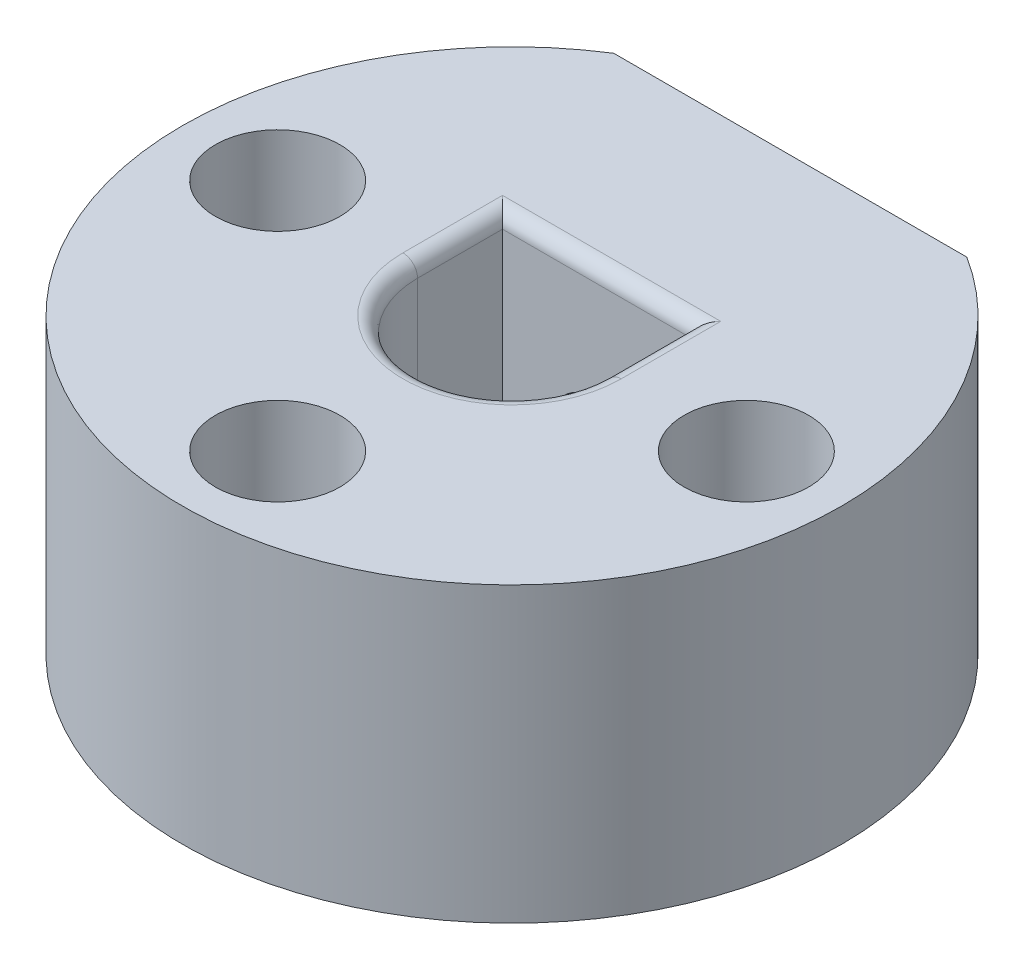
ISO-10303-21;
HEADER;
FILE_DESCRIPTION(('STEP AP214'),'2;1');
FILE_NAME('part.step','',(''),(''),'','','');
FILE_SCHEMA(('AUTOMOTIVE_DESIGN { 1 0 10303 214 1 1 1 1 }'));
ENDSEC;
DATA;
#1=APPLICATION_CONTEXT('core data for automotive mechanical design processes');
#2=APPLICATION_PROTOCOL_DEFINITION('international standard','automotive_design',2000,#1);
#3=PRODUCT_CONTEXT('',#1,'mechanical');
#4=PRODUCT('Part','Part','',(#3));
#5=PRODUCT_RELATED_PRODUCT_CATEGORY('part','',(#4));
#6=PRODUCT_DEFINITION_FORMATION('','',#4);
#7=PRODUCT_DEFINITION_CONTEXT('part definition',#1,'design');
#8=PRODUCT_DEFINITION('design','',#6,#7);
#9=PRODUCT_DEFINITION_SHAPE('','',#8);
#10=(LENGTH_UNIT() NAMED_UNIT(*) SI_UNIT(.MILLI.,.METRE.));
#11=(NAMED_UNIT(*) PLANE_ANGLE_UNIT() SI_UNIT($,.RADIAN.));
#12=(NAMED_UNIT(*) SI_UNIT($,.STERADIAN.) SOLID_ANGLE_UNIT());
#13=UNCERTAINTY_MEASURE_WITH_UNIT(LENGTH_MEASURE(1.E-05),#10,'distance_accuracy_value','');
#14=(GEOMETRIC_REPRESENTATION_CONTEXT(3) GLOBAL_UNCERTAINTY_ASSIGNED_CONTEXT((#13)) GLOBAL_UNIT_ASSIGNED_CONTEXT((#10,
#11,#12)) REPRESENTATION_CONTEXT('',''));
#15=CARTESIAN_POINT('',(0.,0.,0.));
#16=DIRECTION('',(0.,0.,1.));
#17=DIRECTION('',(1.,0.,0.));
#18=AXIS2_PLACEMENT_3D('',#15,#16,#17);
#19=CARTESIAN_POINT('',(0.,4.5,-9.5));
#20=DIRECTION('',(0.,0.,1.));
#21=DIRECTION('',(1.,0.,0.));
#22=AXIS2_PLACEMENT_3D('',#19,#20,#21);
#23=CYLINDRICAL_SURFACE('',#22,1.6);
#24=DIRECTION('',(0.,0.,1.));
#25=VECTOR('',#24,1.);
#26=CARTESIAN_POINT('',(0.556776436283002,3.,-9.5));
#27=LINE('',#26,#25);
#28=CARTESIAN_POINT('',(0.556776436283002,3.,-2.9));
#29=VERTEX_POINT('',#28);
#30=CARTESIAN_POINT('',(0.556776436283002,3.,-4.4));
#31=VERTEX_POINT('',#30);
#32=EDGE_CURVE('E291',#29,#31,#27,.F.);
#33=ORIENTED_EDGE('',*,*,#32,.F.);
#34=CARTESIAN_POINT('',(0.,4.5,-2.9));
#35=DIRECTION('',(0.,0.,1.));
#36=DIRECTION('',(1.,0.,0.));
#37=AXIS2_PLACEMENT_3D('',#34,#35,#36);
#38=CIRCLE('',#37,1.6);
#39=CARTESIAN_POINT('',(-0.556776436283002,3.,-2.9));
#40=VERTEX_POINT('',#39);
#41=EDGE_CURVE('E184',#29,#40,#38,.T.);
#42=ORIENTED_EDGE('',*,*,#41,.T.);
#43=DIRECTION('',(0.,0.,1.));
#44=VECTOR('',#43,1.);
#45=CARTESIAN_POINT('',(-0.556776436283002,3.,-9.5));
#46=LINE('',#45,#44);
#47=CARTESIAN_POINT('',(-0.556776436283002,3.,-4.4));
#48=VERTEX_POINT('',#47);
#49=EDGE_CURVE('E293',#48,#40,#46,.T.);
#50=ORIENTED_EDGE('',*,*,#49,.F.);
#51=CARTESIAN_POINT('',(0.,4.5,-4.4));
#52=DIRECTION('',(0.,0.,-1.));
#53=DIRECTION('',(-1.,0.,0.));
#54=AXIS2_PLACEMENT_3D('',#51,#52,#53);
#55=CIRCLE('',#54,1.6);
#56=EDGE_CURVE('E180',#31,#48,#55,.F.);
#57=ORIENTED_EDGE('',*,*,#56,.F.);
#58=EDGE_LOOP('',(#33,#42,#50,#57));
#59=FACE_BOUND('',#58,.T.);
#60=ADVANCED_FACE('F36',(#59),#23,.F.);
#61=CARTESIAN_POINT('',(0.,10.,0.));
#62=DIRECTION('',(0.,-1.,0.));
#63=DIRECTION('',(0.,0.,-1.));
#64=AXIS2_PLACEMENT_3D('',#61,#62,#63);
#65=CYLINDRICAL_SURFACE('',#64,3.225);
#66=DIRECTION('',(0.,-1.,0.));
#67=VECTOR('',#66,1.);
#68=CARTESIAN_POINT('',(3.225,10.,0.));
#69=LINE('',#68,#67);
#70=CARTESIAN_POINT('',(3.225,9.5,0.));
#71=VERTEX_POINT('',#70);
#72=CARTESIAN_POINT('',(3.225,3.,0.));
#73=VERTEX_POINT('',#72);
#74=EDGE_CURVE('E232',#71,#73,#69,.T.);
#75=ORIENTED_EDGE('',*,*,#74,.T.);
#76=CARTESIAN_POINT('',(0.,3.,0.));
#77=DIRECTION('',(0.,-1.,0.));
#78=DIRECTION('',(0.,0.,-1.));
#79=AXIS2_PLACEMENT_3D('',#76,#77,#78);
#80=CIRCLE('',#79,3.225);
#81=CARTESIAN_POINT('',(-3.225,3.,0.));
#82=VERTEX_POINT('',#81);
#83=EDGE_CURVE('E304',#73,#82,#80,.T.);
#84=ORIENTED_EDGE('',*,*,#83,.T.);
#85=DIRECTION('',(0.,-1.,0.));
#86=VECTOR('',#85,1.);
#87=CARTESIAN_POINT('',(-3.225,10.,0.));
#88=LINE('',#87,#86);
#89=CARTESIAN_POINT('',(-3.225,9.5,0.));
#90=VERTEX_POINT('',#89);
#91=EDGE_CURVE('E223',#90,#82,#88,.T.);
#92=ORIENTED_EDGE('',*,*,#91,.F.);
#93=CARTESIAN_POINT('',(0.,9.5,0.));
#94=DIRECTION('',(0.,1.,0.));
#95=DIRECTION('',(0.,0.,1.));
#96=AXIS2_PLACEMENT_3D('',#93,#94,#95);
#97=CIRCLE('',#96,3.225);
#98=EDGE_CURVE('E267',#90,#71,#97,.T.);
#99=ORIENTED_EDGE('',*,*,#98,.T.);
#100=EDGE_LOOP('',(#75,#84,#92,#99));
#101=FACE_BOUND('',#100,.T.);
#102=ADVANCED_FACE('F344',(#101),#65,.F.);
#103=CARTESIAN_POINT('',(3.225,10.,0.));
#104=DIRECTION('',(-1.,0.,0.));
#105=DIRECTION('',(0.,0.,1.));
#106=AXIS2_PLACEMENT_3D('',#103,#104,#105);
#107=PLANE('',#106);
#108=DIRECTION('',(0.,-1.,0.));
#109=VECTOR('',#108,1.);
#110=CARTESIAN_POINT('',(3.225,10.,-2.9));
#111=LINE('',#110,#109);
#112=CARTESIAN_POINT('',(3.225,9.5,-2.9));
#113=VERTEX_POINT('',#112);
#114=CARTESIAN_POINT('',(3.225,3.,-2.9));
#115=VERTEX_POINT('',#114);
#116=EDGE_CURVE('E229',#113,#115,#111,.T.);
#117=ORIENTED_EDGE('',*,*,#116,.T.);
#118=DIRECTION('',(0.,0.,1.));
#119=VECTOR('',#118,1.);
#120=CARTESIAN_POINT('',(3.225,3.,0.));
#121=LINE('',#120,#119);
#122=EDGE_CURVE('E307',#115,#73,#121,.T.);
#123=ORIENTED_EDGE('',*,*,#122,.T.);
#124=ORIENTED_EDGE('',*,*,#74,.F.);
#125=DIRECTION('',(0.,0.,-1.));
#126=VECTOR('',#125,1.);
#127=CARTESIAN_POINT('',(3.225,9.5,0.));
#128=LINE('',#127,#126);
#129=EDGE_CURVE('E263',#71,#113,#128,.T.);
#130=ORIENTED_EDGE('',*,*,#129,.T.);
#131=EDGE_LOOP('',(#117,#123,#124,#130));
#132=FACE_BOUND('',#131,.T.);
#133=ADVANCED_FACE('F350',(#132),#107,.T.);
#134=CARTESIAN_POINT('',(3.225,10.,-2.9));
#135=DIRECTION('',(0.,0.,1.));
#136=DIRECTION('',(1.,0.,0.));
#137=AXIS2_PLACEMENT_3D('',#134,#135,#136);
#138=PLANE('',#137);
#139=DIRECTION('',(0.,-1.,0.));
#140=VECTOR('',#139,1.);
#141=CARTESIAN_POINT('',(-3.225,10.,-2.9));
#142=LINE('',#141,#140);
#143=CARTESIAN_POINT('',(-3.225,9.5,-2.9));
#144=VERTEX_POINT('',#143);
#145=CARTESIAN_POINT('',(-3.225,3.,-2.9));
#146=VERTEX_POINT('',#145);
#147=EDGE_CURVE('E226',#144,#146,#142,.T.);
#148=ORIENTED_EDGE('',*,*,#147,.T.);
#149=DIRECTION('',(1.,0.,0.));
#150=VECTOR('',#149,1.);
#151=CARTESIAN_POINT('',(3.225,3.,-2.9));
#152=LINE('',#151,#150);
#153=EDGE_CURVE('E295',#146,#40,#152,.T.);
#154=ORIENTED_EDGE('',*,*,#153,.T.);
#155=ORIENTED_EDGE('',*,*,#41,.F.);
#156=EDGE_CURVE('E299',#29,#115,#152,.T.);
#157=ORIENTED_EDGE('',*,*,#156,.T.);
#158=ORIENTED_EDGE('',*,*,#116,.F.);
#159=DIRECTION('',(-1.,0.,0.));
#160=VECTOR('',#159,1.);
#161=CARTESIAN_POINT('',(3.225,9.5,-2.9));
#162=LINE('',#161,#160);
#163=EDGE_CURVE('E265',#113,#144,#162,.T.);
#164=ORIENTED_EDGE('',*,*,#163,.T.);
#165=EDGE_LOOP('',(#148,#154,#155,#157,#158,#164));
#166=FACE_BOUND('',#165,.T.);
#167=ADVANCED_FACE('F426',(#166),#138,.T.);
#168=CARTESIAN_POINT('',(-3.225,10.,0.));
#169=DIRECTION('',(1.,0.,0.));
#170=DIRECTION('',(0.,0.,-1.));
#171=AXIS2_PLACEMENT_3D('',#168,#169,#170);
#172=PLANE('',#171);
#173=ORIENTED_EDGE('',*,*,#91,.T.);
#174=DIRECTION('',(0.,0.,-1.));
#175=VECTOR('',#174,1.);
#176=CARTESIAN_POINT('',(-3.225,3.,0.));
#177=LINE('',#176,#175);
#178=EDGE_CURVE('E297',#82,#146,#177,.T.);
#179=ORIENTED_EDGE('',*,*,#178,.T.);
#180=ORIENTED_EDGE('',*,*,#147,.F.);
#181=DIRECTION('',(0.,0.,1.));
#182=VECTOR('',#181,1.);
#183=CARTESIAN_POINT('',(-3.225,9.5,0.));
#184=LINE('',#183,#182);
#185=EDGE_CURVE('E251',#144,#90,#184,.T.);
#186=ORIENTED_EDGE('',*,*,#185,.T.);
#187=EDGE_LOOP('',(#173,#179,#180,#186));
#188=FACE_BOUND('',#187,.T.);
#189=ADVANCED_FACE('F365',(#188),#172,.T.);
#190=CARTESIAN_POINT('',(0.,0.,0.));
#191=DIRECTION('',(0.,1.,0.));
#192=DIRECTION('',(0.,0.,1.));
#193=AXIS2_PLACEMENT_3D('',#190,#191,#192);
#194=PLANE('',#193);
#195=CARTESIAN_POINT('',(0.,0.,0.));
#196=DIRECTION('',(0.,1.,0.));
#197=DIRECTION('',(0.,0.,1.));
#198=AXIS2_PLACEMENT_3D('',#195,#196,#197);
#199=CIRCLE('',#198,11.25);
#200=CARTESIAN_POINT('',(-6.02598539659698,0.,-9.5));
#201=VERTEX_POINT('',#200);
#202=CARTESIAN_POINT('',(6.02598539659698,0.,-9.5));
#203=VERTEX_POINT('',#202);
#204=EDGE_CURVE('E235',#201,#203,#199,.T.);
#205=ORIENTED_EDGE('',*,*,#204,.F.);
#206=DIRECTION('',(-1.,0.,0.));
#207=VECTOR('',#206,1.);
#208=CARTESIAN_POINT('',(6.02598539659698,0.,-9.5));
#209=LINE('',#208,#207);
#210=EDGE_CURVE('E240',#203,#201,#209,.T.);
#211=ORIENTED_EDGE('',*,*,#210,.F.);
#212=EDGE_LOOP('',(#205,#211));
#213=FACE_BOUND('',#212,.T.);
#214=CARTESIAN_POINT('',(0.,0.,8.));
#215=DIRECTION('',(0.,1.,0.));
#216=DIRECTION('',(0.,0.,1.));
#217=AXIS2_PLACEMENT_3D('',#214,#215,#216);
#218=CIRCLE('',#217,1.25);
#219=CARTESIAN_POINT('',(0.,0.,9.25));
#220=VERTEX_POINT('',#219);
#221=EDGE_CURVE('E220',#220,#220,#218,.T.);
#222=ORIENTED_EDGE('',*,*,#221,.T.);
#223=EDGE_LOOP('',(#222));
#224=FACE_BOUND('',#223,.T.);
#225=CARTESIAN_POINT('',(-8.,0.,-1.68080962984129E-13));
#226=DIRECTION('',(0.,1.,0.));
#227=DIRECTION('',(0.,0.,1.));
#228=AXIS2_PLACEMENT_3D('',#225,#226,#227);
#229=CIRCLE('',#228,1.25);
#230=CARTESIAN_POINT('',(-8.,0.,1.24999999999983));
#231=VERTEX_POINT('',#230);
#232=EDGE_CURVE('E208',#231,#231,#229,.T.);
#233=ORIENTED_EDGE('',*,*,#232,.T.);
#234=EDGE_LOOP('',(#233));
#235=FACE_BOUND('',#234,.T.);
#236=CARTESIAN_POINT('',(8.,0.,0.));
#237=DIRECTION('',(0.,1.,0.));
#238=DIRECTION('',(0.,0.,1.));
#239=AXIS2_PLACEMENT_3D('',#236,#237,#238);
#240=CIRCLE('',#239,1.25);
#241=CARTESIAN_POINT('',(8.,0.,1.25));
#242=VERTEX_POINT('',#241);
#243=EDGE_CURVE('E196',#242,#242,#240,.T.);
#244=ORIENTED_EDGE('',*,*,#243,.T.);
#245=EDGE_LOOP('',(#244));
#246=FACE_BOUND('',#245,.T.);
#247=DIRECTION('',(1.,0.,0.));
#248=VECTOR('',#247,1.);
#249=CARTESIAN_POINT('',(-2.925,0.,-4.4));
#250=LINE('',#249,#248);
#251=CARTESIAN_POINT('',(-2.925,0.,-4.4));
#252=VERTEX_POINT('',#251);
#253=CARTESIAN_POINT('',(-0.943398113205662,0.,-4.4));
#254=VERTEX_POINT('',#253);
#255=EDGE_CURVE('E158',#252,#254,#250,.T.);
#256=ORIENTED_EDGE('',*,*,#255,.T.);
#257=CARTESIAN_POINT('',(0.,0.,0.));
#258=DIRECTION('',(0.,-1.,0.));
#259=DIRECTION('',(0.,0.,-1.));
#260=AXIS2_PLACEMENT_3D('',#257,#258,#259);
#261=CIRCLE('',#260,4.5);
#262=CARTESIAN_POINT('',(0.943398113205662,0.,-4.4));
#263=VERTEX_POINT('',#262);
#264=EDGE_CURVE('E150',#263,#254,#261,.T.);
#265=ORIENTED_EDGE('',*,*,#264,.F.);
#266=CARTESIAN_POINT('',(2.925,0.,-4.4));
#267=VERTEX_POINT('',#266);
#268=EDGE_CURVE('E59',#263,#267,#250,.T.);
#269=ORIENTED_EDGE('',*,*,#268,.T.);
#270=DIRECTION('',(0.,0.,-1.));
#271=VECTOR('',#270,1.);
#272=CARTESIAN_POINT('',(2.925,0.,-4.4));
#273=LINE('',#272,#271);
#274=CARTESIAN_POINT('',(2.925,0.,-6.65));
#275=VERTEX_POINT('',#274);
#276=EDGE_CURVE('E311',#267,#275,#273,.T.);
#277=ORIENTED_EDGE('',*,*,#276,.T.);
#278=DIRECTION('',(-1.,0.,0.));
#279=VECTOR('',#278,1.);
#280=CARTESIAN_POINT('',(-2.925,0.,-6.65));
#281=LINE('',#280,#279);
#282=CARTESIAN_POINT('',(-2.925,0.,-6.65));
#283=VERTEX_POINT('',#282);
#284=EDGE_CURVE('E167',#275,#283,#281,.T.);
#285=ORIENTED_EDGE('',*,*,#284,.T.);
#286=DIRECTION('',(0.,0.,1.));
#287=VECTOR('',#286,1.);
#288=CARTESIAN_POINT('',(-2.925,0.,-4.4));
#289=LINE('',#288,#287);
#290=EDGE_CURVE('E164',#283,#252,#289,.T.);
#291=ORIENTED_EDGE('',*,*,#290,.T.);
#292=EDGE_LOOP('',(#256,#265,#269,#277,#285,#291));
#293=FACE_BOUND('',#292,.T.);
#294=ADVANCED_FACE('F155',(#213,#224,#235,#246,#293),#194,.F.);
#295=CARTESIAN_POINT('',(0.,4.5,-9.5));
#296=DIRECTION('',(0.,0.,1.));
#297=DIRECTION('',(1.,0.,0.));
#298=AXIS2_PLACEMENT_3D('',#295,#296,#297);
#299=CIRCLE('',#298,1.6);
#300=CARTESIAN_POINT('',(1.6,4.5,-9.5));
#301=VERTEX_POINT('',#300);
#302=EDGE_CURVE('E181',#301,#301,#299,.T.);
#303=ORIENTED_EDGE('',*,*,#302,.F.);
#304=EDGE_LOOP('',(#303));
#305=FACE_BOUND('',#304,.T.);
#306=CARTESIAN_POINT('',(0.,4.5,-6.65));
#307=DIRECTION('',(0.,0.,1.));
#308=DIRECTION('',(1.,0.,0.));
#309=AXIS2_PLACEMENT_3D('',#306,#307,#308);
#310=CIRCLE('',#309,1.6);
#311=CARTESIAN_POINT('',(1.6,4.5,-6.65));
#312=VERTEX_POINT('',#311);
#313=EDGE_CURVE('E185',#312,#312,#310,.F.);
#314=ORIENTED_EDGE('',*,*,#313,.F.);
#315=EDGE_LOOP('',(#314));
#316=FACE_BOUND('',#315,.T.);
#317=ADVANCED_FACE('F346',(#305,#316),#23,.F.);
#318=CARTESIAN_POINT('',(0.,10.,0.));
#319=DIRECTION('',(0.,1.,0.));
#320=DIRECTION('',(0.,0.,1.));
#321=AXIS2_PLACEMENT_3D('',#318,#319,#320);
#322=PLANE('',#321);
#323=DIRECTION('',(0.,0.,1.));
#324=VECTOR('',#323,1.);
#325=CARTESIAN_POINT('',(-3.725,10.,0.));
#326=LINE('',#325,#324);
#327=CARTESIAN_POINT('',(-3.725,10.,0.));
#328=VERTEX_POINT('',#327);
#329=CARTESIAN_POINT('',(-3.725,10.,-3.4));
#330=VERTEX_POINT('',#329);
#331=EDGE_CURVE('E258',#328,#330,#326,.F.);
#332=ORIENTED_EDGE('',*,*,#331,.T.);
#333=DIRECTION('',(-1.,0.,0.));
#334=VECTOR('',#333,1.);
#335=CARTESIAN_POINT('',(0.,10.,-3.4));
#336=LINE('',#335,#334);
#337=CARTESIAN_POINT('',(3.725,10.,-3.4));
#338=VERTEX_POINT('',#337);
#339=EDGE_CURVE('E261',#330,#338,#336,.F.);
#340=ORIENTED_EDGE('',*,*,#339,.T.);
#341=DIRECTION('',(0.,0.,-1.));
#342=VECTOR('',#341,1.);
#343=CARTESIAN_POINT('',(3.725,10.,0.));
#344=LINE('',#343,#342);
#345=CARTESIAN_POINT('',(3.725,10.,0.));
#346=VERTEX_POINT('',#345);
#347=EDGE_CURVE('E256',#338,#346,#344,.F.);
#348=ORIENTED_EDGE('',*,*,#347,.T.);
#349=CARTESIAN_POINT('',(0.,10.,0.));
#350=DIRECTION('',(0.,1.,0.));
#351=DIRECTION('',(0.,0.,1.));
#352=AXIS2_PLACEMENT_3D('',#349,#350,#351);
#353=CIRCLE('',#352,3.725);
#354=EDGE_CURVE('E254',#346,#328,#353,.F.);
#355=ORIENTED_EDGE('',*,*,#354,.T.);
#356=EDGE_LOOP('',(#332,#340,#348,#355));
#357=FACE_BOUND('',#356,.T.);
#358=CARTESIAN_POINT('',(8.,10.,0.));
#359=DIRECTION('',(0.,1.,0.));
#360=DIRECTION('',(0.,0.,1.));
#361=AXIS2_PLACEMENT_3D('',#358,#359,#360);
#362=CIRCLE('',#361,2.125);
#363=CARTESIAN_POINT('',(8.,10.,2.125));
#364=VERTEX_POINT('',#363);
#365=EDGE_CURVE('E186',#364,#364,#362,.T.);
#366=ORIENTED_EDGE('',*,*,#365,.F.);
#367=EDGE_LOOP('',(#366));
#368=FACE_BOUND('',#367,.T.);
#369=CARTESIAN_POINT('',(-8.,10.,-1.68080962984129E-13));
#370=DIRECTION('',(0.,1.,0.));
#371=DIRECTION('',(0.,0.,1.));
#372=AXIS2_PLACEMENT_3D('',#369,#370,#371);
#373=CIRCLE('',#372,2.125);
#374=CARTESIAN_POINT('',(-8.,10.,2.12499999999983));
#375=VERTEX_POINT('',#374);
#376=EDGE_CURVE('E199',#375,#375,#373,.T.);
#377=ORIENTED_EDGE('',*,*,#376,.F.);
#378=EDGE_LOOP('',(#377));
#379=FACE_BOUND('',#378,.T.);
#380=CARTESIAN_POINT('',(0.,10.,8.));
#381=DIRECTION('',(0.,1.,0.));
#382=DIRECTION('',(0.,0.,1.));
#383=AXIS2_PLACEMENT_3D('',#380,#381,#382);
#384=CIRCLE('',#383,2.125);
#385=CARTESIAN_POINT('',(0.,10.,10.125));
#386=VERTEX_POINT('',#385);
#387=EDGE_CURVE('E211',#386,#386,#384,.T.);
#388=ORIENTED_EDGE('',*,*,#387,.F.);
#389=EDGE_LOOP('',(#388));
#390=FACE_BOUND('',#389,.T.);
#391=CARTESIAN_POINT('',(0.,10.,0.));
#392=DIRECTION('',(0.,1.,0.));
#393=DIRECTION('',(0.,0.,1.));
#394=AXIS2_PLACEMENT_3D('',#391,#392,#393);
#395=CIRCLE('',#394,11.25);
#396=CARTESIAN_POINT('',(-6.02598539659698,10.,-9.5));
#397=VERTEX_POINT('',#396);
#398=CARTESIAN_POINT('',(6.02598539659698,10.,-9.5));
#399=VERTEX_POINT('',#398);
#400=EDGE_CURVE('E236',#397,#399,#395,.T.);
#401=ORIENTED_EDGE('',*,*,#400,.T.);
#402=DIRECTION('',(-1.,0.,0.));
#403=VECTOR('',#402,1.);
#404=CARTESIAN_POINT('',(6.02598539659698,10.,-9.5));
#405=LINE('',#404,#403);
#406=EDGE_CURVE('E239',#399,#397,#405,.T.);
#407=ORIENTED_EDGE('',*,*,#406,.T.);
#408=EDGE_LOOP('',(#401,#407));
#409=FACE_BOUND('',#408,.T.);
#410=ADVANCED_FACE('F356',(#357,#368,#379,#390,#409),#322,.T.);
#411=CARTESIAN_POINT('',(0.,10.,0.));
#412=DIRECTION('',(0.,-1.,0.));
#413=DIRECTION('',(0.,0.,-1.));
#414=AXIS2_PLACEMENT_3D('',#411,#412,#413);
#415=CYLINDRICAL_SURFACE('',#414,11.25);
#416=ORIENTED_EDGE('',*,*,#204,.T.);
#417=DIRECTION('',(0.,-1.,0.));
#418=VECTOR('',#417,1.);
#419=CARTESIAN_POINT('',(6.02598539659698,10.,-9.5));
#420=LINE('',#419,#418);
#421=EDGE_CURVE('E248',#399,#203,#420,.T.);
#422=ORIENTED_EDGE('',*,*,#421,.F.);
#423=ORIENTED_EDGE('',*,*,#400,.F.);
#424=DIRECTION('',(0.,-1.,0.));
#425=VECTOR('',#424,1.);
#426=CARTESIAN_POINT('',(-6.02598539659698,10.,-9.5));
#427=LINE('',#426,#425);
#428=EDGE_CURVE('E242',#397,#201,#427,.T.);
#429=ORIENTED_EDGE('',*,*,#428,.T.);
#430=EDGE_LOOP('',(#416,#422,#423,#429));
#431=FACE_BOUND('',#430,.T.);
#432=ADVANCED_FACE('F362',(#431),#415,.T.);
#433=CARTESIAN_POINT('',(6.02598539659698,10.,-9.5));
#434=DIRECTION('',(0.,0.,1.));
#435=DIRECTION('',(1.,0.,0.));
#436=AXIS2_PLACEMENT_3D('',#433,#434,#435);
#437=PLANE('',#436);
#438=ORIENTED_EDGE('',*,*,#302,.T.);
#439=EDGE_LOOP('',(#438));
#440=FACE_BOUND('',#439,.T.);
#441=ORIENTED_EDGE('',*,*,#210,.T.);
#442=ORIENTED_EDGE('',*,*,#428,.F.);
#443=ORIENTED_EDGE('',*,*,#406,.F.);
#444=ORIENTED_EDGE('',*,*,#421,.T.);
#445=EDGE_LOOP('',(#441,#442,#443,#444));
#446=FACE_BOUND('',#445,.T.);
#447=ADVANCED_FACE('F459',(#440,#446),#437,.F.);
#448=CARTESIAN_POINT('',(0.,10.,8.));
#449=DIRECTION('',(0.,1.,0.));
#450=DIRECTION('',(0.,0.,1.));
#451=AXIS2_PLACEMENT_3D('',#448,#449,#450);
#452=CYLINDRICAL_SURFACE('',#451,1.25);
#453=ORIENTED_EDGE('',*,*,#221,.F.);
#454=EDGE_LOOP('',(#453));
#455=FACE_BOUND('',#454,.T.);
#456=CARTESIAN_POINT('',(0.,1.5,8.));
#457=DIRECTION('',(0.,1.,0.));
#458=DIRECTION('',(0.,0.,1.));
#459=AXIS2_PLACEMENT_3D('',#456,#457,#458);
#460=CIRCLE('',#459,1.25);
#461=CARTESIAN_POINT('',(0.,1.5,9.25));
#462=VERTEX_POINT('',#461);
#463=EDGE_CURVE('E217',#462,#462,#460,.T.);
#464=ORIENTED_EDGE('',*,*,#463,.T.);
#465=EDGE_LOOP('',(#464));
#466=FACE_BOUND('',#465,.T.);
#467=ADVANCED_FACE('F462',(#455,#466),#452,.F.);
#468=CARTESIAN_POINT('',(1.24999999999997,1.5,8.));
#469=DIRECTION('',(0.,-1.,0.));
#470=DIRECTION('',(0.,0.,-1.));
#471=AXIS2_PLACEMENT_3D('',#468,#469,#470);
#472=PLANE('',#471);
#473=ORIENTED_EDGE('',*,*,#463,.F.);
#474=EDGE_LOOP('',(#473));
#475=FACE_BOUND('',#474,.T.);
#476=CARTESIAN_POINT('',(0.,1.5,8.));
#477=DIRECTION('',(0.,1.,0.));
#478=DIRECTION('',(0.,0.,1.));
#479=AXIS2_PLACEMENT_3D('',#476,#477,#478);
#480=CIRCLE('',#479,2.125);
#481=CARTESIAN_POINT('',(0.,1.5,10.125));
#482=VERTEX_POINT('',#481);
#483=EDGE_CURVE('E214',#482,#482,#480,.T.);
#484=ORIENTED_EDGE('',*,*,#483,.T.);
#485=EDGE_LOOP('',(#484));
#486=FACE_BOUND('',#485,.T.);
#487=ADVANCED_FACE('F545',(#475,#486),#472,.F.);
#488=CARTESIAN_POINT('',(0.,10.,8.));
#489=DIRECTION('',(0.,1.,0.));
#490=DIRECTION('',(0.,0.,1.));
#491=AXIS2_PLACEMENT_3D('',#488,#489,#490);
#492=CYLINDRICAL_SURFACE('',#491,2.125);
#493=ORIENTED_EDGE('',*,*,#483,.F.);
#494=EDGE_LOOP('',(#493));
#495=FACE_BOUND('',#494,.T.);
#496=ORIENTED_EDGE('',*,*,#387,.T.);
#497=EDGE_LOOP('',(#496));
#498=FACE_BOUND('',#497,.T.);
#499=ADVANCED_FACE('F541',(#495,#498),#492,.F.);
#500=CARTESIAN_POINT('',(-8.,10.,-1.68080962984129E-13));
#501=DIRECTION('',(0.,1.,0.));
#502=DIRECTION('',(0.,0.,1.));
#503=AXIS2_PLACEMENT_3D('',#500,#501,#502);
#504=CYLINDRICAL_SURFACE('',#503,1.25);
#505=ORIENTED_EDGE('',*,*,#232,.F.);
#506=EDGE_LOOP('',(#505));
#507=FACE_BOUND('',#506,.T.);
#508=CARTESIAN_POINT('',(-8.,1.5,-1.68080962984129E-13));
#509=DIRECTION('',(0.,1.,0.));
#510=DIRECTION('',(0.,0.,1.));
#511=AXIS2_PLACEMENT_3D('',#508,#509,#510);
#512=CIRCLE('',#511,1.25);
#513=CARTESIAN_POINT('',(-8.,1.5,1.24999999999983));
#514=VERTEX_POINT('',#513);
#515=EDGE_CURVE('E205',#514,#514,#512,.T.);
#516=ORIENTED_EDGE('',*,*,#515,.T.);
#517=EDGE_LOOP('',(#516));
#518=FACE_BOUND('',#517,.T.);
#519=ADVANCED_FACE('F537',(#507,#518),#504,.F.);
#520=CARTESIAN_POINT('',(-6.75,1.5,-1.68080962984129E-13));
#521=DIRECTION('',(0.,-1.,0.));
#522=DIRECTION('',(0.,0.,-1.));
#523=AXIS2_PLACEMENT_3D('',#520,#521,#522);
#524=PLANE('',#523);
#525=ORIENTED_EDGE('',*,*,#515,.F.);
#526=EDGE_LOOP('',(#525));
#527=FACE_BOUND('',#526,.T.);
#528=CARTESIAN_POINT('',(-8.,1.5,-1.68080962984129E-13));
#529=DIRECTION('',(0.,1.,0.));
#530=DIRECTION('',(0.,0.,1.));
#531=AXIS2_PLACEMENT_3D('',#528,#529,#530);
#532=CIRCLE('',#531,2.125);
#533=CARTESIAN_POINT('',(-8.,1.5,2.12499999999983));
#534=VERTEX_POINT('',#533);
#535=EDGE_CURVE('E202',#534,#534,#532,.T.);
#536=ORIENTED_EDGE('',*,*,#535,.T.);
#537=EDGE_LOOP('',(#536));
#538=FACE_BOUND('',#537,.T.);
#539=ADVANCED_FACE('F533',(#527,#538),#524,.F.);
#540=CARTESIAN_POINT('',(-8.,10.,-1.68080962984129E-13));
#541=DIRECTION('',(0.,1.,0.));
#542=DIRECTION('',(0.,0.,1.));
#543=AXIS2_PLACEMENT_3D('',#540,#541,#542);
#544=CYLINDRICAL_SURFACE('',#543,2.125);
#545=ORIENTED_EDGE('',*,*,#535,.F.);
#546=EDGE_LOOP('',(#545));
#547=FACE_BOUND('',#546,.T.);
#548=ORIENTED_EDGE('',*,*,#376,.T.);
#549=EDGE_LOOP('',(#548));
#550=FACE_BOUND('',#549,.T.);
#551=ADVANCED_FACE('F517',(#547,#550),#544,.F.);
#552=CARTESIAN_POINT('',(8.,10.,0.));
#553=DIRECTION('',(0.,1.,0.));
#554=DIRECTION('',(0.,0.,1.));
#555=AXIS2_PLACEMENT_3D('',#552,#553,#554);
#556=CYLINDRICAL_SURFACE('',#555,1.25);
#557=ORIENTED_EDGE('',*,*,#243,.F.);
#558=EDGE_LOOP('',(#557));
#559=FACE_BOUND('',#558,.T.);
#560=CARTESIAN_POINT('',(8.,1.5,0.));
#561=DIRECTION('',(0.,1.,0.));
#562=DIRECTION('',(0.,0.,1.));
#563=AXIS2_PLACEMENT_3D('',#560,#561,#562);
#564=CIRCLE('',#563,1.25);
#565=CARTESIAN_POINT('',(8.,1.5,1.25));
#566=VERTEX_POINT('',#565);
#567=EDGE_CURVE('E193',#566,#566,#564,.T.);
#568=ORIENTED_EDGE('',*,*,#567,.T.);
#569=EDGE_LOOP('',(#568));
#570=FACE_BOUND('',#569,.T.);
#571=ADVANCED_FACE('F513',(#559,#570),#556,.F.);
#572=CARTESIAN_POINT('',(9.25,1.5,0.));
#573=DIRECTION('',(0.,-1.,0.));
#574=DIRECTION('',(0.,0.,-1.));
#575=AXIS2_PLACEMENT_3D('',#572,#573,#574);
#576=PLANE('',#575);
#577=ORIENTED_EDGE('',*,*,#567,.F.);
#578=EDGE_LOOP('',(#577));
#579=FACE_BOUND('',#578,.T.);
#580=CARTESIAN_POINT('',(8.,1.5,0.));
#581=DIRECTION('',(0.,1.,0.));
#582=DIRECTION('',(0.,0.,1.));
#583=AXIS2_PLACEMENT_3D('',#580,#581,#582);
#584=CIRCLE('',#583,2.125);
#585=CARTESIAN_POINT('',(8.,1.5,2.125));
#586=VERTEX_POINT('',#585);
#587=EDGE_CURVE('E189',#586,#586,#584,.T.);
#588=ORIENTED_EDGE('',*,*,#587,.T.);
#589=EDGE_LOOP('',(#588));
#590=FACE_BOUND('',#589,.T.);
#591=ADVANCED_FACE('F516',(#579,#590),#576,.F.);
#592=CARTESIAN_POINT('',(8.,10.,0.));
#593=DIRECTION('',(0.,1.,0.));
#594=DIRECTION('',(0.,0.,1.));
#595=AXIS2_PLACEMENT_3D('',#592,#593,#594);
#596=CYLINDRICAL_SURFACE('',#595,2.125);
#597=ORIENTED_EDGE('',*,*,#587,.F.);
#598=EDGE_LOOP('',(#597));
#599=FACE_BOUND('',#598,.T.);
#600=ORIENTED_EDGE('',*,*,#365,.T.);
#601=EDGE_LOOP('',(#600));
#602=FACE_BOUND('',#601,.T.);
#603=ADVANCED_FACE('F475',(#599,#602),#596,.F.);
#604=CARTESIAN_POINT('',(3.725,9.5,0.));
#605=DIRECTION('',(0.,0.,-1.));
#606=DIRECTION('',(-1.,0.,0.));
#607=AXIS2_PLACEMENT_3D('',#604,#605,#606);
#608=CYLINDRICAL_SURFACE('',#607,0.5);
#609=CARTESIAN_POINT('',(3.725,9.5,0.));
#610=DIRECTION('',(0.,0.,1.));
#611=DIRECTION('',(1.,0.,0.));
#612=AXIS2_PLACEMENT_3D('',#609,#610,#611);
#613=CIRCLE('',#612,0.5);
#614=EDGE_CURVE('E274',#346,#71,#613,.T.);
#615=ORIENTED_EDGE('',*,*,#614,.F.);
#616=ORIENTED_EDGE('',*,*,#347,.F.);
#617=CARTESIAN_POINT('',(3.725,9.5,-3.4));
#618=DIRECTION('',(-0.707106781186548,0.,-0.707106781186547));
#619=DIRECTION('',(0.707106781186547,0.,-0.707106781186548));
#620=AXIS2_PLACEMENT_3D('',#617,#618,#619);
#621=ELLIPSE('',#620,0.707106781186547,0.5);
#622=EDGE_CURVE('E190',#113,#338,#621,.T.);
#623=ORIENTED_EDGE('',*,*,#622,.F.);
#624=ORIENTED_EDGE('',*,*,#129,.F.);
#625=EDGE_LOOP('',(#615,#616,#623,#624));
#626=FACE_BOUND('',#625,.T.);
#627=ADVANCED_FACE('F38',(#626),#608,.T.);
#628=CARTESIAN_POINT('',(3.225,9.5,-3.4));
#629=DIRECTION('',(-1.,0.,0.));
#630=DIRECTION('',(0.,0.,1.));
#631=AXIS2_PLACEMENT_3D('',#628,#629,#630);
#632=CYLINDRICAL_SURFACE('',#631,0.5);
#633=ORIENTED_EDGE('',*,*,#622,.T.);
#634=ORIENTED_EDGE('',*,*,#339,.F.);
#635=CARTESIAN_POINT('',(-3.725,9.5,-3.4));
#636=DIRECTION('',(-0.707106781186548,0.,0.707106781186547));
#637=DIRECTION('',(0.707106781186547,0.,0.707106781186548));
#638=AXIS2_PLACEMENT_3D('',#635,#636,#637);
#639=ELLIPSE('',#638,0.707106781186547,0.5);
#640=EDGE_CURVE('E272',#144,#330,#639,.T.);
#641=ORIENTED_EDGE('',*,*,#640,.F.);
#642=ORIENTED_EDGE('',*,*,#163,.F.);
#643=EDGE_LOOP('',(#633,#634,#641,#642));
#644=FACE_BOUND('',#643,.T.);
#645=ADVANCED_FACE('F468',(#644),#632,.T.);
#646=CARTESIAN_POINT('',(0.,9.5,0.));
#647=DIRECTION('',(0.,1.,0.));
#648=DIRECTION('',(0.,0.,1.));
#649=AXIS2_PLACEMENT_3D('',#646,#647,#648);
#650=TOROIDAL_SURFACE('',#649,3.725,0.5);
#651=ORIENTED_EDGE('',*,*,#614,.T.);
#652=ORIENTED_EDGE('',*,*,#98,.F.);
#653=CARTESIAN_POINT('',(-3.725,9.5,0.));
#654=DIRECTION('',(0.,0.,-1.));
#655=DIRECTION('',(-1.,0.,0.));
#656=AXIS2_PLACEMENT_3D('',#653,#654,#655);
#657=CIRCLE('',#656,0.5);
#658=EDGE_CURVE('E270',#328,#90,#657,.T.);
#659=ORIENTED_EDGE('',*,*,#658,.F.);
#660=ORIENTED_EDGE('',*,*,#354,.F.);
#661=EDGE_LOOP('',(#651,#652,#659,#660));
#662=FACE_BOUND('',#661,.T.);
#663=ADVANCED_FACE('F379',(#662),#650,.T.);
#664=CARTESIAN_POINT('',(-3.725,9.5,0.));
#665=DIRECTION('',(0.,0.,1.));
#666=DIRECTION('',(1.,0.,0.));
#667=AXIS2_PLACEMENT_3D('',#664,#665,#666);
#668=CYLINDRICAL_SURFACE('',#667,0.5);
#669=ORIENTED_EDGE('',*,*,#640,.T.);
#670=ORIENTED_EDGE('',*,*,#331,.F.);
#671=ORIENTED_EDGE('',*,*,#658,.T.);
#672=ORIENTED_EDGE('',*,*,#185,.F.);
#673=EDGE_LOOP('',(#669,#670,#671,#672));
#674=FACE_BOUND('',#673,.T.);
#675=ADVANCED_FACE('F372',(#674),#668,.T.);
#676=CARTESIAN_POINT('',(-2.925,7.25,-6.65));
#677=DIRECTION('',(0.,0.,1.));
#678=DIRECTION('',(1.,0.,0.));
#679=AXIS2_PLACEMENT_3D('',#676,#677,#678);
#680=PLANE('',#679);
#681=ORIENTED_EDGE('',*,*,#284,.F.);
#682=DIRECTION('',(0.,-1.,0.));
#683=VECTOR('',#682,1.);
#684=CARTESIAN_POINT('',(2.925,7.25,-6.65));
#685=LINE('',#684,#683);
#686=CARTESIAN_POINT('',(2.925,7.25,-6.65));
#687=VERTEX_POINT('',#686);
#688=EDGE_CURVE('E177',#687,#275,#685,.T.);
#689=ORIENTED_EDGE('',*,*,#688,.F.);
#690=DIRECTION('',(-1.,0.,0.));
#691=VECTOR('',#690,1.);
#692=CARTESIAN_POINT('',(-2.925,7.25,-6.65));
#693=LINE('',#692,#691);
#694=CARTESIAN_POINT('',(-2.925,7.25,-6.65));
#695=VERTEX_POINT('',#694);
#696=EDGE_CURVE('E314',#687,#695,#693,.T.);
#697=ORIENTED_EDGE('',*,*,#696,.T.);
#698=DIRECTION('',(0.,-1.,0.));
#699=VECTOR('',#698,1.);
#700=CARTESIAN_POINT('',(-2.925,7.25,-6.65));
#701=LINE('',#700,#699);
#702=EDGE_CURVE('E175',#695,#283,#701,.T.);
#703=ORIENTED_EDGE('',*,*,#702,.T.);
#704=EDGE_LOOP('',(#681,#689,#697,#703));
#705=FACE_BOUND('',#704,.T.);
#706=ORIENTED_EDGE('',*,*,#313,.T.);
#707=EDGE_LOOP('',(#706));
#708=FACE_BOUND('',#707,.T.);
#709=ADVANCED_FACE('F323',(#705,#708),#680,.T.);
#710=CARTESIAN_POINT('',(-2.925,7.25,-4.4));
#711=DIRECTION('',(0.,0.,-1.));
#712=DIRECTION('',(-1.,0.,0.));
#713=AXIS2_PLACEMENT_3D('',#710,#711,#712);
#714=PLANE('',#713);
#715=DIRECTION('',(0.,-1.,0.));
#716=VECTOR('',#715,1.);
#717=CARTESIAN_POINT('',(0.943398113205669,3.,-4.4));
#718=LINE('',#717,#716);
#719=CARTESIAN_POINT('',(0.943398113205662,3.,-4.4));
#720=VERTEX_POINT('',#719);
#721=EDGE_CURVE('E11',#720,#263,#718,.T.);
#722=ORIENTED_EDGE('',*,*,#721,.F.);
#723=DIRECTION('',(-1.,0.,0.));
#724=VECTOR('',#723,1.);
#725=CARTESIAN_POINT('',(-2.925,3.,-4.4));
#726=LINE('',#725,#724);
#727=EDGE_CURVE('E44',#720,#31,#726,.T.);
#728=ORIENTED_EDGE('',*,*,#727,.T.);
#729=ORIENTED_EDGE('',*,*,#56,.T.);
#730=CARTESIAN_POINT('',(-0.943398113205662,3.,-4.4));
#731=VERTEX_POINT('',#730);
#732=EDGE_CURVE('E269',#48,#731,#726,.T.);
#733=ORIENTED_EDGE('',*,*,#732,.T.);
#734=DIRECTION('',(0.,-1.,0.));
#735=VECTOR('',#734,1.);
#736=CARTESIAN_POINT('',(-0.943398113205669,3.,-4.4));
#737=LINE('',#736,#735);
#738=EDGE_CURVE('E286',#254,#731,#737,.F.);
#739=ORIENTED_EDGE('',*,*,#738,.F.);
#740=ORIENTED_EDGE('',*,*,#255,.F.);
#741=DIRECTION('',(0.,-1.,0.));
#742=VECTOR('',#741,1.);
#743=CARTESIAN_POINT('',(-2.925,7.25,-4.4));
#744=LINE('',#743,#742);
#745=CARTESIAN_POINT('',(-2.925,7.25,-4.4));
#746=VERTEX_POINT('',#745);
#747=EDGE_CURVE('E172',#746,#252,#744,.T.);
#748=ORIENTED_EDGE('',*,*,#747,.F.);
#749=DIRECTION('',(1.,0.,0.));
#750=VECTOR('',#749,1.);
#751=CARTESIAN_POINT('',(-2.925,7.25,-4.4));
#752=LINE('',#751,#750);
#753=CARTESIAN_POINT('',(2.925,7.25,-4.4));
#754=VERTEX_POINT('',#753);
#755=EDGE_CURVE('E173',#746,#754,#752,.T.);
#756=ORIENTED_EDGE('',*,*,#755,.T.);
#757=DIRECTION('',(0.,-1.,0.));
#758=VECTOR('',#757,1.);
#759=CARTESIAN_POINT('',(2.925,7.25,-4.4));
#760=LINE('',#759,#758);
#761=EDGE_CURVE('E163',#754,#267,#760,.T.);
#762=ORIENTED_EDGE('',*,*,#761,.T.);
#763=ORIENTED_EDGE('',*,*,#268,.F.);
#764=EDGE_LOOP('',(#722,#728,#729,#733,#739,#740,#748,#756,#762,#763));
#765=FACE_BOUND('',#764,.T.);
#766=ADVANCED_FACE('F161',(#765),#714,.T.);
#767=CARTESIAN_POINT('',(2.925,7.25,-4.4));
#768=DIRECTION('',(-1.,0.,0.));
#769=DIRECTION('',(0.,0.,1.));
#770=AXIS2_PLACEMENT_3D('',#767,#768,#769);
#771=PLANE('',#770);
#772=ORIENTED_EDGE('',*,*,#276,.F.);
#773=ORIENTED_EDGE('',*,*,#761,.F.);
#774=DIRECTION('',(0.,0.,-1.));
#775=VECTOR('',#774,1.);
#776=CARTESIAN_POINT('',(2.925,7.25,-4.4));
#777=LINE('',#776,#775);
#778=EDGE_CURVE('E166',#754,#687,#777,.T.);
#779=ORIENTED_EDGE('',*,*,#778,.T.);
#780=ORIENTED_EDGE('',*,*,#688,.T.);
#781=EDGE_LOOP('',(#772,#773,#779,#780));
#782=FACE_BOUND('',#781,.T.);
#783=ADVANCED_FACE('F327',(#782),#771,.T.);
#784=CARTESIAN_POINT('',(-2.925,7.25,-4.4));
#785=DIRECTION('',(1.,0.,0.));
#786=DIRECTION('',(0.,0.,-1.));
#787=AXIS2_PLACEMENT_3D('',#784,#785,#786);
#788=PLANE('',#787);
#789=ORIENTED_EDGE('',*,*,#290,.F.);
#790=ORIENTED_EDGE('',*,*,#702,.F.);
#791=DIRECTION('',(0.,0.,1.));
#792=VECTOR('',#791,1.);
#793=CARTESIAN_POINT('',(-2.925,7.25,-4.4));
#794=LINE('',#793,#792);
#795=EDGE_CURVE('E316',#695,#746,#794,.T.);
#796=ORIENTED_EDGE('',*,*,#795,.T.);
#797=ORIENTED_EDGE('',*,*,#747,.T.);
#798=EDGE_LOOP('',(#789,#790,#796,#797));
#799=FACE_BOUND('',#798,.T.);
#800=ADVANCED_FACE('F334',(#799),#788,.T.);
#801=CARTESIAN_POINT('',(0.,7.25,0.));
#802=DIRECTION('',(0.,-1.,0.));
#803=DIRECTION('',(0.,0.,-1.));
#804=AXIS2_PLACEMENT_3D('',#801,#802,#803);
#805=PLANE('',#804);
#806=ORIENTED_EDGE('',*,*,#778,.F.);
#807=ORIENTED_EDGE('',*,*,#755,.F.);
#808=ORIENTED_EDGE('',*,*,#795,.F.);
#809=ORIENTED_EDGE('',*,*,#696,.F.);
#810=EDGE_LOOP('',(#806,#807,#808,#809));
#811=FACE_BOUND('',#810,.T.);
#812=ADVANCED_FACE('F331',(#811),#805,.T.);
#813=CARTESIAN_POINT('',(0.,3.,0.));
#814=DIRECTION('',(0.,-1.,0.));
#815=DIRECTION('',(0.,0.,-1.));
#816=AXIS2_PLACEMENT_3D('',#813,#814,#815);
#817=CYLINDRICAL_SURFACE('',#816,4.5);
#818=ORIENTED_EDGE('',*,*,#721,.T.);
#819=ORIENTED_EDGE('',*,*,#264,.T.);
#820=ORIENTED_EDGE('',*,*,#738,.T.);
#821=CARTESIAN_POINT('',(0.,3.,0.));
#822=DIRECTION('',(0.,-1.,0.));
#823=DIRECTION('',(0.,0.,-1.));
#824=AXIS2_PLACEMENT_3D('',#821,#822,#823);
#825=CIRCLE('',#824,4.5);
#826=EDGE_CURVE('E51',#720,#731,#825,.T.);
#827=ORIENTED_EDGE('',*,*,#826,.F.);
#828=EDGE_LOOP('',(#818,#819,#820,#827));
#829=FACE_BOUND('',#828,.T.);
#830=ADVANCED_FACE('F149',(#829),#817,.F.);
#831=CARTESIAN_POINT('',(0.,3.,0.));
#832=DIRECTION('',(0.,-1.,0.));
#833=DIRECTION('',(0.,0.,-1.));
#834=AXIS2_PLACEMENT_3D('',#831,#832,#833);
#835=PLANE('',#834);
#836=ORIENTED_EDGE('',*,*,#826,.T.);
#837=ORIENTED_EDGE('',*,*,#732,.F.);
#838=ORIENTED_EDGE('',*,*,#49,.T.);
#839=ORIENTED_EDGE('',*,*,#153,.F.);
#840=ORIENTED_EDGE('',*,*,#178,.F.);
#841=ORIENTED_EDGE('',*,*,#83,.F.);
#842=ORIENTED_EDGE('',*,*,#122,.F.);
#843=ORIENTED_EDGE('',*,*,#156,.F.);
#844=ORIENTED_EDGE('',*,*,#32,.T.);
#845=ORIENTED_EDGE('',*,*,#727,.F.);
#846=EDGE_LOOP('',(#836,#837,#838,#839,#840,#841,#842,#843,#844,#845));
#847=FACE_BOUND('',#846,.T.);
#848=ADVANCED_FACE('F336',(#847),#835,.T.);
#849=CLOSED_SHELL('',(#60,#102,#133,#167,#189,#294,#317,#410,#432,#447,#467,#487,#499,#519,#539,
#551,#571,#591,#603,#627,#645,#663,#675,#709,#766,#783,#800,#812,#830,#848));
#850=MANIFOLD_SOLID_BREP('B2',#849);
#851=ADVANCED_BREP_SHAPE_REPRESENTATION('',(#18,#850),#14);
#852=SHAPE_DEFINITION_REPRESENTATION(#9,#851);
ENDSEC;
END-ISO-10303-21;
